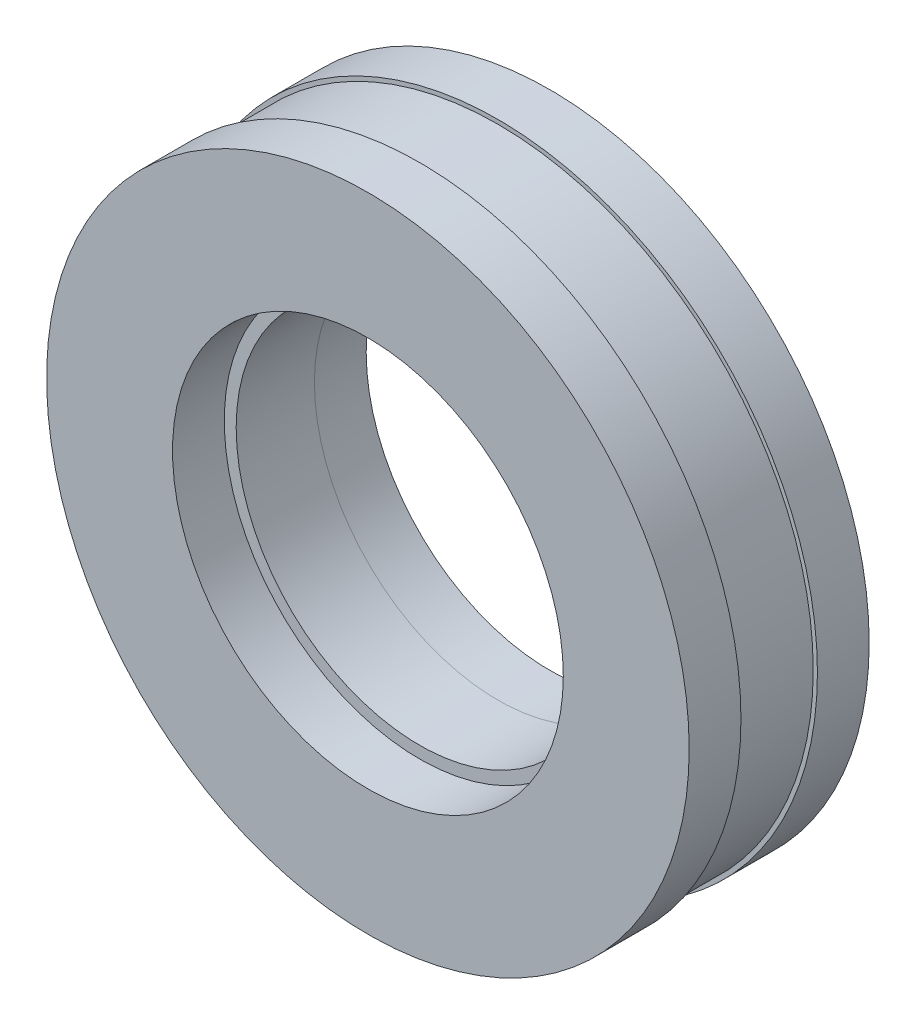
ISO-10303-21;
HEADER;
FILE_DESCRIPTION(('STEP AP214'),'2;1');
FILE_NAME('part.step','',(''),(''),'','','');
FILE_SCHEMA(('AUTOMOTIVE_DESIGN { 1 0 10303 214 1 1 1 1 }'));
ENDSEC;
DATA;
#1=APPLICATION_CONTEXT('core data for automotive mechanical design processes');
#2=APPLICATION_PROTOCOL_DEFINITION('international standard','automotive_design',2000,#1);
#3=PRODUCT_CONTEXT('',#1,'mechanical');
#4=PRODUCT('Part','Part','',(#3));
#5=PRODUCT_RELATED_PRODUCT_CATEGORY('part','',(#4));
#6=PRODUCT_DEFINITION_FORMATION('','',#4);
#7=PRODUCT_DEFINITION_CONTEXT('part definition',#1,'design');
#8=PRODUCT_DEFINITION('design','',#6,#7);
#9=PRODUCT_DEFINITION_SHAPE('','',#8);
#10=(LENGTH_UNIT() NAMED_UNIT(*) SI_UNIT(.MILLI.,.METRE.));
#11=(NAMED_UNIT(*) PLANE_ANGLE_UNIT() SI_UNIT($,.RADIAN.));
#12=(NAMED_UNIT(*) SI_UNIT($,.STERADIAN.) SOLID_ANGLE_UNIT());
#13=UNCERTAINTY_MEASURE_WITH_UNIT(LENGTH_MEASURE(1.E-05),#10,'distance_accuracy_value','');
#14=(GEOMETRIC_REPRESENTATION_CONTEXT(3) GLOBAL_UNCERTAINTY_ASSIGNED_CONTEXT((#13)) GLOBAL_UNIT_ASSIGNED_CONTEXT((#10,
#11,#12)) REPRESENTATION_CONTEXT('',''));
#15=CARTESIAN_POINT('',(0.,0.,0.));
#16=DIRECTION('',(0.,0.,1.));
#17=DIRECTION('',(1.,0.,0.));
#18=AXIS2_PLACEMENT_3D('',#15,#16,#17);
#19=CARTESIAN_POINT('',(0.,0.,7.0866));
#20=DIRECTION('',(0.,0.,1.));
#21=DIRECTION('',(1.,0.,0.));
#22=AXIS2_PLACEMENT_3D('',#19,#20,#21);
#23=PLANE('',#22);
#24=CARTESIAN_POINT('',(0.,0.,7.0866));
#25=DIRECTION('',(0.,0.,1.));
#26=DIRECTION('',(1.,0.,0.));
#27=AXIS2_PLACEMENT_3D('',#24,#25,#26);
#28=CIRCLE('',#27,9.9949);
#29=CARTESIAN_POINT('',(9.9949,0.,7.0866));
#30=VERTEX_POINT('',#29);
#31=EDGE_CURVE('E106',#30,#30,#28,.T.);
#32=ORIENTED_EDGE('',*,*,#31,.F.);
#33=EDGE_LOOP('',(#32));
#34=FACE_BOUND('',#33,.T.);
#35=CARTESIAN_POINT('',(0.,0.,7.0866));
#36=DIRECTION('',(0.,0.,1.));
#37=DIRECTION('',(1.,0.,0.));
#38=AXIS2_PLACEMENT_3D('',#35,#36,#37);
#39=CIRCLE('',#38,10.6426);
#40=CARTESIAN_POINT('',(10.6426,0.,7.0866));
#41=VERTEX_POINT('',#40);
#42=EDGE_CURVE('E119',#41,#41,#39,.T.);
#43=ORIENTED_EDGE('',*,*,#42,.T.);
#44=EDGE_LOOP('',(#43));
#45=FACE_BOUND('',#44,.T.);
#46=ADVANCED_FACE('F32',(#34,#45),#23,.T.);
#47=CARTESIAN_POINT('',(0.,0.,2.8194));
#48=DIRECTION('',(0.,0.,1.));
#49=DIRECTION('',(1.,0.,0.));
#50=AXIS2_PLACEMENT_3D('',#47,#48,#49);
#51=PLANE('',#50);
#52=CARTESIAN_POINT('',(0.,0.,2.8194));
#53=DIRECTION('',(0.,0.,1.));
#54=DIRECTION('',(1.,0.,0.));
#55=AXIS2_PLACEMENT_3D('',#52,#53,#54);
#56=CIRCLE('',#55,17.1704);
#57=CARTESIAN_POINT('',(17.1704,0.,2.8194));
#58=VERTEX_POINT('',#57);
#59=EDGE_CURVE('E10',#58,#58,#56,.T.);
#60=ORIENTED_EDGE('',*,*,#59,.F.);
#61=EDGE_LOOP('',(#60));
#62=FACE_BOUND('',#61,.T.);
#63=CARTESIAN_POINT('',(0.,0.,2.8194));
#64=DIRECTION('',(0.,0.,1.));
#65=DIRECTION('',(1.,0.,0.));
#66=AXIS2_PLACEMENT_3D('',#63,#64,#65);
#67=CIRCLE('',#66,17.399);
#68=CARTESIAN_POINT('',(17.399,0.,2.8194));
#69=VERTEX_POINT('',#68);
#70=EDGE_CURVE('E42',#69,#69,#67,.T.);
#71=ORIENTED_EDGE('',*,*,#70,.T.);
#72=EDGE_LOOP('',(#71));
#73=FACE_BOUND('',#72,.T.);
#74=ADVANCED_FACE('F80',(#62,#73),#51,.T.);
#75=CARTESIAN_POINT('',(0.,0.,0.));
#76=DIRECTION('',(0.,0.,1.));
#77=DIRECTION('',(1.,0.,0.));
#78=AXIS2_PLACEMENT_3D('',#75,#76,#77);
#79=PLANE('',#78);
#80=CARTESIAN_POINT('',(0.,0.,0.));
#81=DIRECTION('',(0.,0.,1.));
#82=DIRECTION('',(1.,0.,0.));
#83=AXIS2_PLACEMENT_3D('',#80,#81,#82);
#84=CIRCLE('',#83,17.399);
#85=CARTESIAN_POINT('',(17.399,0.,0.));
#86=VERTEX_POINT('',#85);
#87=EDGE_CURVE('E47',#86,#86,#84,.T.);
#88=ORIENTED_EDGE('',*,*,#87,.F.);
#89=EDGE_LOOP('',(#88));
#90=FACE_BOUND('',#89,.T.);
#91=CARTESIAN_POINT('',(0.,0.,0.));
#92=DIRECTION('',(0.,0.,1.));
#93=DIRECTION('',(1.,0.,0.));
#94=AXIS2_PLACEMENT_3D('',#91,#92,#93);
#95=CIRCLE('',#94,10.);
#96=CARTESIAN_POINT('',(10.,0.,0.));
#97=VERTEX_POINT('',#96);
#98=EDGE_CURVE('E62',#97,#97,#95,.T.);
#99=ORIENTED_EDGE('',*,*,#98,.T.);
#100=EDGE_LOOP('',(#99));
#101=FACE_BOUND('',#100,.T.);
#102=ADVANCED_FACE('F90',(#90,#101),#79,.F.);
#103=CARTESIAN_POINT('',(0.,0.,2.8194));
#104=DIRECTION('',(0.,0.,-1.));
#105=DIRECTION('',(-1.,0.,0.));
#106=AXIS2_PLACEMENT_3D('',#103,#104,#105);
#107=CYLINDRICAL_SURFACE('',#106,17.399);
#108=ORIENTED_EDGE('',*,*,#70,.F.);
#109=EDGE_LOOP('',(#108));
#110=FACE_BOUND('',#109,.T.);
#111=ORIENTED_EDGE('',*,*,#87,.T.);
#112=EDGE_LOOP('',(#111));
#113=FACE_BOUND('',#112,.T.);
#114=ADVANCED_FACE('F34',(#110,#113),#107,.T.);
#115=CARTESIAN_POINT('',(0.,0.,2.8194));
#116=DIRECTION('',(0.,0.,-1.));
#117=DIRECTION('',(-1.,0.,0.));
#118=AXIS2_PLACEMENT_3D('',#115,#116,#117);
#119=CYLINDRICAL_SURFACE('',#118,10.);
#120=CARTESIAN_POINT('',(0.,0.,2.8194));
#121=DIRECTION('',(0.,0.,1.));
#122=DIRECTION('',(1.,0.,0.));
#123=AXIS2_PLACEMENT_3D('',#120,#121,#122);
#124=CIRCLE('',#123,10.);
#125=CARTESIAN_POINT('',(10.,0.,2.8194));
#126=VERTEX_POINT('',#125);
#127=EDGE_CURVE('E57',#126,#126,#124,.T.);
#128=ORIENTED_EDGE('',*,*,#127,.T.);
#129=EDGE_LOOP('',(#128));
#130=FACE_BOUND('',#129,.T.);
#131=ORIENTED_EDGE('',*,*,#98,.F.);
#132=EDGE_LOOP('',(#131));
#133=FACE_BOUND('',#132,.T.);
#134=ADVANCED_FACE('F83',(#130,#133),#119,.F.);
#135=CARTESIAN_POINT('',(0.,0.,7.0866));
#136=DIRECTION('',(0.,0.,-1.));
#137=DIRECTION('',(-1.,0.,0.));
#138=AXIS2_PLACEMENT_3D('',#135,#136,#137);
#139=CYLINDRICAL_SURFACE('',#138,17.1704);
#140=CARTESIAN_POINT('',(0.,0.,7.0866));
#141=DIRECTION('',(0.,0.,1.));
#142=DIRECTION('',(1.,0.,0.));
#143=AXIS2_PLACEMENT_3D('',#140,#141,#142);
#144=CIRCLE('',#143,17.1704);
#145=CARTESIAN_POINT('',(17.1704,0.,7.0866));
#146=VERTEX_POINT('',#145);
#147=EDGE_CURVE('E51',#146,#146,#144,.T.);
#148=ORIENTED_EDGE('',*,*,#147,.F.);
#149=EDGE_LOOP('',(#148));
#150=FACE_BOUND('',#149,.T.);
#151=ORIENTED_EDGE('',*,*,#59,.T.);
#152=EDGE_LOOP('',(#151));
#153=FACE_BOUND('',#152,.T.);
#154=ADVANCED_FACE('F74',(#150,#153),#139,.T.);
#155=CARTESIAN_POINT('',(0.,0.,7.0866));
#156=DIRECTION('',(0.,0.,-1.));
#157=DIRECTION('',(-1.,0.,0.));
#158=AXIS2_PLACEMENT_3D('',#155,#156,#157);
#159=CYLINDRICAL_SURFACE('',#158,9.9949);
#160=ORIENTED_EDGE('',*,*,#31,.T.);
#161=EDGE_LOOP('',(#160));
#162=FACE_BOUND('',#161,.T.);
#163=ORIENTED_EDGE('',*,*,#127,.F.);
#164=EDGE_LOOP('',(#163));
#165=FACE_BOUND('',#164,.T.);
#166=ADVANCED_FACE('F63',(#162,#165),#159,.F.);
#167=CARTESIAN_POINT('',(0.,0.,7.0866));
#168=DIRECTION('',(0.,0.,1.));
#169=DIRECTION('',(1.,0.,0.));
#170=AXIS2_PLACEMENT_3D('',#167,#168,#169);
#171=PLANE('',#170);
#172=CARTESIAN_POINT('',(0.,0.,7.0866));
#173=DIRECTION('',(0.,0.,1.));
#174=DIRECTION('',(1.,0.,0.));
#175=AXIS2_PLACEMENT_3D('',#172,#173,#174);
#176=CIRCLE('',#175,17.5006);
#177=CARTESIAN_POINT('',(17.5006,0.,7.0866));
#178=VERTEX_POINT('',#177);
#179=EDGE_CURVE('E113',#178,#178,#176,.T.);
#180=ORIENTED_EDGE('',*,*,#179,.F.);
#181=EDGE_LOOP('',(#180));
#182=FACE_BOUND('',#181,.T.);
#183=ORIENTED_EDGE('',*,*,#147,.T.);
#184=EDGE_LOOP('',(#183));
#185=FACE_BOUND('',#184,.T.);
#186=ADVANCED_FACE('F73',(#182,#185),#171,.F.);
#187=CARTESIAN_POINT('',(0.,0.,9.906));
#188=DIRECTION('',(0.,0.,1.));
#189=DIRECTION('',(1.,0.,0.));
#190=AXIS2_PLACEMENT_3D('',#187,#188,#189);
#191=PLANE('',#190);
#192=CARTESIAN_POINT('',(0.,0.,9.906));
#193=DIRECTION('',(0.,0.,1.));
#194=DIRECTION('',(1.,0.,0.));
#195=AXIS2_PLACEMENT_3D('',#192,#193,#194);
#196=CIRCLE('',#195,17.5006);
#197=CARTESIAN_POINT('',(17.5006,0.,9.906));
#198=VERTEX_POINT('',#197);
#199=EDGE_CURVE('E111',#198,#198,#196,.T.);
#200=ORIENTED_EDGE('',*,*,#199,.T.);
#201=EDGE_LOOP('',(#200));
#202=FACE_BOUND('',#201,.T.);
#203=CARTESIAN_POINT('',(0.,0.,9.906));
#204=DIRECTION('',(0.,0.,1.));
#205=DIRECTION('',(1.,0.,0.));
#206=AXIS2_PLACEMENT_3D('',#203,#204,#205);
#207=CIRCLE('',#206,10.6426);
#208=CARTESIAN_POINT('',(10.6426,0.,9.906));
#209=VERTEX_POINT('',#208);
#210=EDGE_CURVE('E116',#209,#209,#207,.T.);
#211=ORIENTED_EDGE('',*,*,#210,.F.);
#212=EDGE_LOOP('',(#211));
#213=FACE_BOUND('',#212,.T.);
#214=ADVANCED_FACE('F128',(#202,#213),#191,.T.);
#215=CARTESIAN_POINT('',(0.,0.,9.906));
#216=DIRECTION('',(0.,0.,-1.));
#217=DIRECTION('',(-1.,0.,0.));
#218=AXIS2_PLACEMENT_3D('',#215,#216,#217);
#219=CYLINDRICAL_SURFACE('',#218,17.5006);
#220=ORIENTED_EDGE('',*,*,#199,.F.);
#221=EDGE_LOOP('',(#220));
#222=FACE_BOUND('',#221,.T.);
#223=ORIENTED_EDGE('',*,*,#179,.T.);
#224=EDGE_LOOP('',(#223));
#225=FACE_BOUND('',#224,.T.);
#226=ADVANCED_FACE('F76',(#222,#225),#219,.T.);
#227=CARTESIAN_POINT('',(0.,0.,9.906));
#228=DIRECTION('',(0.,0.,-1.));
#229=DIRECTION('',(-1.,0.,0.));
#230=AXIS2_PLACEMENT_3D('',#227,#228,#229);
#231=CYLINDRICAL_SURFACE('',#230,10.6426);
#232=ORIENTED_EDGE('',*,*,#210,.T.);
#233=EDGE_LOOP('',(#232));
#234=FACE_BOUND('',#233,.T.);
#235=ORIENTED_EDGE('',*,*,#42,.F.);
#236=EDGE_LOOP('',(#235));
#237=FACE_BOUND('',#236,.T.);
#238=ADVANCED_FACE('F125',(#234,#237),#231,.F.);
#239=CLOSED_SHELL('',(#46,#74,#102,#114,#134,#154,#166,#186,#214,#226,#238));
#240=MANIFOLD_SOLID_BREP('B2',#239);
#241=ADVANCED_BREP_SHAPE_REPRESENTATION('',(#18,#240),#14);
#242=SHAPE_DEFINITION_REPRESENTATION(#9,#241);
ENDSEC;
END-ISO-10303-21;
